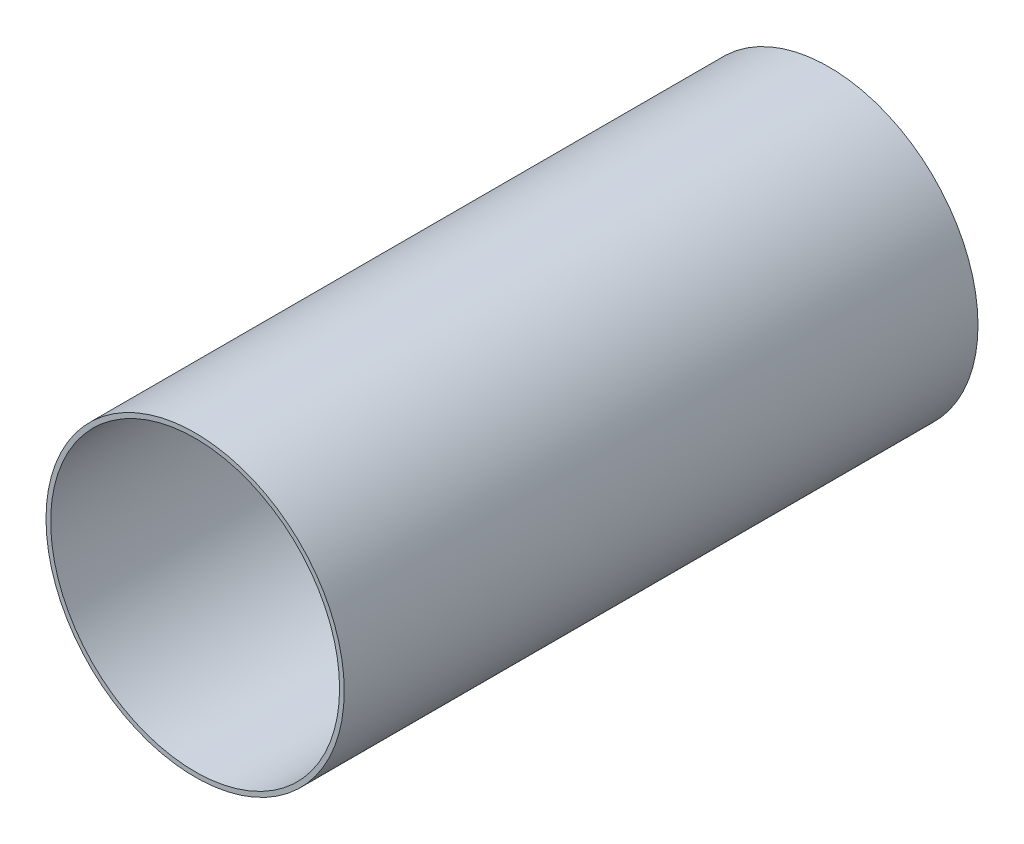
ISO-10303-21;
HEADER;
FILE_DESCRIPTION(('STEP AP214'),'2;1');
FILE_NAME('part.step','',(''),(''),'','','');
FILE_SCHEMA(('AUTOMOTIVE_DESIGN { 1 0 10303 214 1 1 1 1 }'));
ENDSEC;
DATA;
#1=APPLICATION_CONTEXT('core data for automotive mechanical design processes');
#2=APPLICATION_PROTOCOL_DEFINITION('international standard','automotive_design',2000,#1);
#3=PRODUCT_CONTEXT('',#1,'mechanical');
#4=PRODUCT('Part','Part','',(#3));
#5=PRODUCT_RELATED_PRODUCT_CATEGORY('part','',(#4));
#6=PRODUCT_DEFINITION_FORMATION('','',#4);
#7=PRODUCT_DEFINITION_CONTEXT('part definition',#1,'design');
#8=PRODUCT_DEFINITION('design','',#6,#7);
#9=PRODUCT_DEFINITION_SHAPE('','',#8);
#10=(LENGTH_UNIT() NAMED_UNIT(*) SI_UNIT(.MILLI.,.METRE.));
#11=(NAMED_UNIT(*) PLANE_ANGLE_UNIT() SI_UNIT($,.RADIAN.));
#12=(NAMED_UNIT(*) SI_UNIT($,.STERADIAN.) SOLID_ANGLE_UNIT());
#13=UNCERTAINTY_MEASURE_WITH_UNIT(LENGTH_MEASURE(1.E-05),#10,'distance_accuracy_value','');
#14=(GEOMETRIC_REPRESENTATION_CONTEXT(3) GLOBAL_UNCERTAINTY_ASSIGNED_CONTEXT((#13)) GLOBAL_UNIT_ASSIGNED_CONTEXT((#10,
#11,#12)) REPRESENTATION_CONTEXT('',''));
#15=CARTESIAN_POINT('',(0.,0.,0.));
#16=DIRECTION('',(0.,0.,1.));
#17=DIRECTION('',(1.,0.,0.));
#18=AXIS2_PLACEMENT_3D('',#15,#16,#17);
#19=CARTESIAN_POINT('',(0.,0.,431.8));
#20=DIRECTION('',(0.,0.,1.));
#21=DIRECTION('',(1.,0.,0.));
#22=AXIS2_PLACEMENT_3D('',#19,#20,#21);
#23=PLANE('',#22);
#24=CARTESIAN_POINT('',(0.,0.,431.8));
#25=DIRECTION('',(0.,0.,1.));
#26=DIRECTION('',(1.,0.,0.));
#27=AXIS2_PLACEMENT_3D('',#24,#25,#26);
#28=CIRCLE('',#27,101.6);
#29=CARTESIAN_POINT('',(101.6,0.,431.8));
#30=VERTEX_POINT('',#29);
#31=EDGE_CURVE('E10',#30,#30,#28,.T.);
#32=ORIENTED_EDGE('',*,*,#31,.T.);
#33=EDGE_LOOP('',(#32));
#34=FACE_BOUND('',#33,.T.);
#35=CARTESIAN_POINT('',(0.,0.,431.8));
#36=DIRECTION('',(0.,0.,1.));
#37=DIRECTION('',(1.,0.,0.));
#38=AXIS2_PLACEMENT_3D('',#35,#36,#37);
#39=CIRCLE('',#38,98.425);
#40=CARTESIAN_POINT('',(98.425,0.,431.8));
#41=VERTEX_POINT('',#40);
#42=EDGE_CURVE('E44',#41,#41,#39,.T.);
#43=ORIENTED_EDGE('',*,*,#42,.F.);
#44=EDGE_LOOP('',(#43));
#45=FACE_BOUND('',#44,.T.);
#46=ADVANCED_FACE('F33',(#34,#45),#23,.T.);
#47=CARTESIAN_POINT('',(0.,0.,0.));
#48=DIRECTION('',(0.,0.,1.));
#49=DIRECTION('',(1.,0.,0.));
#50=AXIS2_PLACEMENT_3D('',#47,#48,#49);
#51=PLANE('',#50);
#52=CARTESIAN_POINT('',(0.,0.,0.));
#53=DIRECTION('',(0.,0.,1.));
#54=DIRECTION('',(1.,0.,0.));
#55=AXIS2_PLACEMENT_3D('',#52,#53,#54);
#56=CIRCLE('',#55,101.6);
#57=CARTESIAN_POINT('',(101.6,0.,0.));
#58=VERTEX_POINT('',#57);
#59=EDGE_CURVE('E37',#58,#58,#56,.T.);
#60=ORIENTED_EDGE('',*,*,#59,.F.);
#61=EDGE_LOOP('',(#60));
#62=FACE_BOUND('',#61,.T.);
#63=CARTESIAN_POINT('',(0.,0.,0.));
#64=DIRECTION('',(0.,0.,1.));
#65=DIRECTION('',(1.,0.,0.));
#66=AXIS2_PLACEMENT_3D('',#63,#64,#65);
#67=CIRCLE('',#66,98.425);
#68=CARTESIAN_POINT('',(98.425,0.,0.));
#69=VERTEX_POINT('',#68);
#70=EDGE_CURVE('E46',#69,#69,#67,.T.);
#71=ORIENTED_EDGE('',*,*,#70,.T.);
#72=EDGE_LOOP('',(#71));
#73=FACE_BOUND('',#72,.T.);
#74=ADVANCED_FACE('F56',(#62,#73),#51,.F.);
#75=CARTESIAN_POINT('',(0.,0.,431.8));
#76=DIRECTION('',(0.,0.,-1.));
#77=DIRECTION('',(-1.,0.,0.));
#78=AXIS2_PLACEMENT_3D('',#75,#76,#77);
#79=CYLINDRICAL_SURFACE('',#78,101.6);
#80=ORIENTED_EDGE('',*,*,#31,.F.);
#81=EDGE_LOOP('',(#80));
#82=FACE_BOUND('',#81,.T.);
#83=ORIENTED_EDGE('',*,*,#59,.T.);
#84=EDGE_LOOP('',(#83));
#85=FACE_BOUND('',#84,.T.);
#86=ADVANCED_FACE('F35',(#82,#85),#79,.T.);
#87=CARTESIAN_POINT('',(0.,0.,431.8));
#88=DIRECTION('',(0.,0.,-1.));
#89=DIRECTION('',(-1.,0.,0.));
#90=AXIS2_PLACEMENT_3D('',#87,#88,#89);
#91=CYLINDRICAL_SURFACE('',#90,98.425);
#92=ORIENTED_EDGE('',*,*,#42,.T.);
#93=EDGE_LOOP('',(#92));
#94=FACE_BOUND('',#93,.T.);
#95=ORIENTED_EDGE('',*,*,#70,.F.);
#96=EDGE_LOOP('',(#95));
#97=FACE_BOUND('',#96,.T.);
#98=ADVANCED_FACE('F52',(#94,#97),#91,.F.);
#99=CLOSED_SHELL('',(#46,#74,#86,#98));
#100=MANIFOLD_SOLID_BREP('B2',#99);
#101=ADVANCED_BREP_SHAPE_REPRESENTATION('',(#18,#100),#14);
#102=SHAPE_DEFINITION_REPRESENTATION(#9,#101);
ENDSEC;
END-ISO-10303-21;
